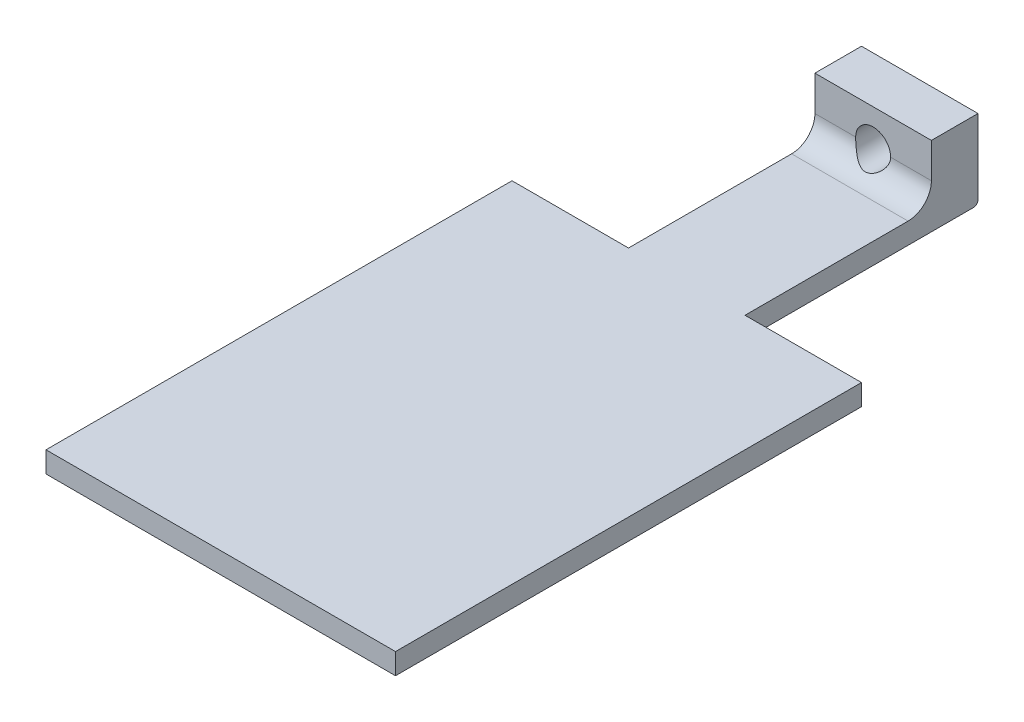
ISO-10303-21;
HEADER;
FILE_DESCRIPTION(('STEP AP214'),'2;1');
FILE_NAME('part.step','',(''),(''),'','','');
FILE_SCHEMA(('AUTOMOTIVE_DESIGN { 1 0 10303 214 1 1 1 1 }'));
ENDSEC;
DATA;
#1=APPLICATION_CONTEXT('core data for automotive mechanical design processes');
#2=APPLICATION_PROTOCOL_DEFINITION('international standard','automotive_design',2000,#1);
#3=PRODUCT_CONTEXT('',#1,'mechanical');
#4=PRODUCT('Part','Part','',(#3));
#5=PRODUCT_RELATED_PRODUCT_CATEGORY('part','',(#4));
#6=PRODUCT_DEFINITION_FORMATION('','',#4);
#7=PRODUCT_DEFINITION_CONTEXT('part definition',#1,'design');
#8=PRODUCT_DEFINITION('design','',#6,#7);
#9=PRODUCT_DEFINITION_SHAPE('','',#8);
#10=(LENGTH_UNIT() NAMED_UNIT(*) SI_UNIT(.MILLI.,.METRE.));
#11=(NAMED_UNIT(*) PLANE_ANGLE_UNIT() SI_UNIT($,.RADIAN.));
#12=(NAMED_UNIT(*) SI_UNIT($,.STERADIAN.) SOLID_ANGLE_UNIT());
#13=UNCERTAINTY_MEASURE_WITH_UNIT(LENGTH_MEASURE(1.E-05),#10,'distance_accuracy_value','');
#14=(GEOMETRIC_REPRESENTATION_CONTEXT(3) GLOBAL_UNCERTAINTY_ASSIGNED_CONTEXT((#13)) GLOBAL_UNIT_ASSIGNED_CONTEXT((#10,
#11,#12)) REPRESENTATION_CONTEXT('',''));
#15=CARTESIAN_POINT('',(0.,0.,0.));
#16=DIRECTION('',(0.,0.,1.));
#17=DIRECTION('',(1.,0.,0.));
#18=AXIS2_PLACEMENT_3D('',#15,#16,#17);
#19=CARTESIAN_POINT('',(0.,1.8,0.));
#20=DIRECTION('',(1.,0.,0.));
#21=DIRECTION('',(0.,0.,-1.));
#22=AXIS2_PLACEMENT_3D('',#19,#20,#21);
#23=PLANE('',#22);
#24=DIRECTION('',(0.,0.,1.));
#25=VECTOR('',#24,1.);
#26=CARTESIAN_POINT('',(0.,0.,0.));
#27=LINE('',#26,#25);
#28=CARTESIAN_POINT('',(0.,0.,0.));
#29=VERTEX_POINT('',#28);
#30=CARTESIAN_POINT('',(0.,0.,40.));
#31=VERTEX_POINT('',#30);
#32=EDGE_CURVE('E153',#29,#31,#27,.T.);
#33=ORIENTED_EDGE('',*,*,#32,.T.);
#34=DIRECTION('',(0.,-1.,0.));
#35=VECTOR('',#34,1.);
#36=CARTESIAN_POINT('',(0.,1.8,40.));
#37=LINE('',#36,#35);
#38=CARTESIAN_POINT('',(0.,1.8,40.));
#39=VERTEX_POINT('',#38);
#40=EDGE_CURVE('E208',#39,#31,#37,.T.);
#41=ORIENTED_EDGE('',*,*,#40,.F.);
#42=DIRECTION('',(0.,0.,1.));
#43=VECTOR('',#42,1.);
#44=CARTESIAN_POINT('',(0.,1.8,0.));
#45=LINE('',#44,#43);
#46=CARTESIAN_POINT('',(0.,1.8,0.));
#47=VERTEX_POINT('',#46);
#48=EDGE_CURVE('E161',#47,#39,#45,.T.);
#49=ORIENTED_EDGE('',*,*,#48,.F.);
#50=DIRECTION('',(0.,-1.,0.));
#51=VECTOR('',#50,1.);
#52=CARTESIAN_POINT('',(0.,1.8,0.));
#53=LINE('',#52,#51);
#54=EDGE_CURVE('E177',#47,#29,#53,.T.);
#55=ORIENTED_EDGE('',*,*,#54,.T.);
#56=EDGE_LOOP('',(#33,#41,#49,#55));
#57=FACE_BOUND('',#56,.T.);
#58=ADVANCED_FACE('F33',(#57),#23,.F.);
#59=CARTESIAN_POINT('',(0.,1.8,40.));
#60=DIRECTION('',(0.,0.,-1.));
#61=DIRECTION('',(-1.,0.,0.));
#62=AXIS2_PLACEMENT_3D('',#59,#60,#61);
#63=PLANE('',#62);
#64=DIRECTION('',(1.,0.,0.));
#65=VECTOR('',#64,1.);
#66=CARTESIAN_POINT('',(0.,0.,40.));
#67=LINE('',#66,#65);
#68=CARTESIAN_POINT('',(30.,0.,40.));
#69=VERTEX_POINT('',#68);
#70=EDGE_CURVE('E156',#31,#69,#67,.T.);
#71=ORIENTED_EDGE('',*,*,#70,.T.);
#72=DIRECTION('',(0.,-1.,0.));
#73=VECTOR('',#72,1.);
#74=CARTESIAN_POINT('',(30.,1.8,40.));
#75=LINE('',#74,#73);
#76=CARTESIAN_POINT('',(30.,1.8,40.));
#77=VERTEX_POINT('',#76);
#78=EDGE_CURVE('E205',#77,#69,#75,.T.);
#79=ORIENTED_EDGE('',*,*,#78,.F.);
#80=DIRECTION('',(1.,0.,0.));
#81=VECTOR('',#80,1.);
#82=CARTESIAN_POINT('',(0.,1.8,40.));
#83=LINE('',#82,#81);
#84=EDGE_CURVE('E164',#39,#77,#83,.T.);
#85=ORIENTED_EDGE('',*,*,#84,.F.);
#86=ORIENTED_EDGE('',*,*,#40,.T.);
#87=EDGE_LOOP('',(#71,#79,#85,#86));
#88=FACE_BOUND('',#87,.T.);
#89=ADVANCED_FACE('F239',(#88),#63,.F.);
#90=CARTESIAN_POINT('',(30.,1.8,0.));
#91=DIRECTION('',(-1.,0.,0.));
#92=DIRECTION('',(0.,0.,1.));
#93=AXIS2_PLACEMENT_3D('',#90,#91,#92);
#94=PLANE('',#93);
#95=DIRECTION('',(0.,0.,-1.));
#96=VECTOR('',#95,1.);
#97=CARTESIAN_POINT('',(30.,0.,0.));
#98=LINE('',#97,#96);
#99=CARTESIAN_POINT('',(30.,0.,0.));
#100=VERTEX_POINT('',#99);
#101=EDGE_CURVE('E180',#69,#100,#98,.T.);
#102=ORIENTED_EDGE('',*,*,#101,.T.);
#103=DIRECTION('',(0.,-1.,0.));
#104=VECTOR('',#103,1.);
#105=CARTESIAN_POINT('',(30.,1.8,0.));
#106=LINE('',#105,#104);
#107=CARTESIAN_POINT('',(30.,1.8,0.));
#108=VERTEX_POINT('',#107);
#109=EDGE_CURVE('E202',#108,#100,#106,.T.);
#110=ORIENTED_EDGE('',*,*,#109,.F.);
#111=DIRECTION('',(0.,0.,-1.));
#112=VECTOR('',#111,1.);
#113=CARTESIAN_POINT('',(30.,1.8,0.));
#114=LINE('',#113,#112);
#115=EDGE_CURVE('E167',#77,#108,#114,.T.);
#116=ORIENTED_EDGE('',*,*,#115,.F.);
#117=ORIENTED_EDGE('',*,*,#78,.T.);
#118=EDGE_LOOP('',(#102,#110,#116,#117));
#119=FACE_BOUND('',#118,.T.);
#120=ADVANCED_FACE('F243',(#119),#94,.F.);
#121=CARTESIAN_POINT('',(20.,1.8,0.));
#122=DIRECTION('',(0.,0.,1.));
#123=DIRECTION('',(1.,0.,0.));
#124=AXIS2_PLACEMENT_3D('',#121,#122,#123);
#125=PLANE('',#124);
#126=DIRECTION('',(-1.,0.,0.));
#127=VECTOR('',#126,1.);
#128=CARTESIAN_POINT('',(20.,0.,0.));
#129=LINE('',#128,#127);
#130=CARTESIAN_POINT('',(20.,0.,0.));
#131=VERTEX_POINT('',#130);
#132=EDGE_CURVE('E182',#100,#131,#129,.T.);
#133=ORIENTED_EDGE('',*,*,#132,.T.);
#134=DIRECTION('',(0.,-1.,0.));
#135=VECTOR('',#134,1.);
#136=CARTESIAN_POINT('',(20.,1.8,0.));
#137=LINE('',#136,#135);
#138=CARTESIAN_POINT('',(20.,1.8,0.));
#139=VERTEX_POINT('',#138);
#140=EDGE_CURVE('E199',#139,#131,#137,.T.);
#141=ORIENTED_EDGE('',*,*,#140,.F.);
#142=DIRECTION('',(-1.,0.,0.));
#143=VECTOR('',#142,1.);
#144=CARTESIAN_POINT('',(20.,1.8,0.));
#145=LINE('',#144,#143);
#146=EDGE_CURVE('E169',#108,#139,#145,.T.);
#147=ORIENTED_EDGE('',*,*,#146,.F.);
#148=ORIENTED_EDGE('',*,*,#109,.T.);
#149=EDGE_LOOP('',(#133,#141,#147,#148));
#150=FACE_BOUND('',#149,.T.);
#151=ADVANCED_FACE('F247',(#150),#125,.F.);
#152=CARTESIAN_POINT('',(20.,1.8,0.));
#153=DIRECTION('',(-1.,0.,0.));
#154=DIRECTION('',(0.,0.,1.));
#155=AXIS2_PLACEMENT_3D('',#152,#153,#154);
#156=PLANE('',#155);
#157=DIRECTION('',(0.,0.,-1.));
#158=VECTOR('',#157,1.);
#159=CARTESIAN_POINT('',(20.,0.,0.));
#160=LINE('',#159,#158);
#161=CARTESIAN_POINT('',(20.,0.,-19.6));
#162=VERTEX_POINT('',#161);
#163=EDGE_CURVE('E184',#131,#162,#160,.T.);
#164=ORIENTED_EDGE('',*,*,#163,.T.);
#165=CARTESIAN_POINT('',(20.,0.4,-19.6));
#166=DIRECTION('',(-1.,0.,0.));
#167=DIRECTION('',(0.,0.,1.));
#168=AXIS2_PLACEMENT_3D('',#165,#166,#167);
#169=CIRCLE('',#168,0.4);
#170=CARTESIAN_POINT('',(20.,0.4,-20.));
#171=VERTEX_POINT('',#170);
#172=EDGE_CURVE('E11',#162,#171,#169,.F.);
#173=ORIENTED_EDGE('',*,*,#172,.T.);
#174=DIRECTION('',(0.,-1.,0.));
#175=VECTOR('',#174,1.);
#176=CARTESIAN_POINT('',(20.,1.8,-20.));
#177=LINE('',#176,#175);
#178=CARTESIAN_POINT('',(20.,6.8,-20.));
#179=VERTEX_POINT('',#178);
#180=EDGE_CURVE('E196',#179,#171,#177,.T.);
#181=ORIENTED_EDGE('',*,*,#180,.F.);
#182=DIRECTION('',(0.,0.,-1.));
#183=VECTOR('',#182,1.);
#184=CARTESIAN_POINT('',(20.,6.8,-20.));
#185=LINE('',#184,#183);
#186=CARTESIAN_POINT('',(20.,6.8,-16.));
#187=VERTEX_POINT('',#186);
#188=EDGE_CURVE('E139',#187,#179,#185,.T.);
#189=ORIENTED_EDGE('',*,*,#188,.F.);
#190=DIRECTION('',(0.,-1.,0.));
#191=VECTOR('',#190,1.);
#192=CARTESIAN_POINT('',(20.,6.8,-16.));
#193=LINE('',#192,#191);
#194=CARTESIAN_POINT('',(20.,3.8,-16.));
#195=VERTEX_POINT('',#194);
#196=EDGE_CURVE('E135',#187,#195,#193,.T.);
#197=ORIENTED_EDGE('',*,*,#196,.T.);
#198=CARTESIAN_POINT('',(20.,3.8,-14.));
#199=DIRECTION('',(-1.,0.,0.));
#200=DIRECTION('',(0.,0.,1.));
#201=AXIS2_PLACEMENT_3D('',#198,#199,#200);
#202=CIRCLE('',#201,2.);
#203=CARTESIAN_POINT('',(20.,1.8,-14.));
#204=VERTEX_POINT('',#203);
#205=EDGE_CURVE('E227',#195,#204,#202,.T.);
#206=ORIENTED_EDGE('',*,*,#205,.T.);
#207=DIRECTION('',(0.,0.,-1.));
#208=VECTOR('',#207,1.);
#209=CARTESIAN_POINT('',(20.,1.8,0.));
#210=LINE('',#209,#208);
#211=EDGE_CURVE('E171',#139,#204,#210,.T.);
#212=ORIENTED_EDGE('',*,*,#211,.F.);
#213=ORIENTED_EDGE('',*,*,#140,.T.);
#214=EDGE_LOOP('',(#164,#173,#181,#189,#197,#206,#212,#213));
#215=FACE_BOUND('',#214,.T.);
#216=ADVANCED_FACE('F251',(#215),#156,.F.);
#217=CARTESIAN_POINT('',(10.,1.8,-20.));
#218=DIRECTION('',(0.,0.,1.));
#219=DIRECTION('',(1.,0.,0.));
#220=AXIS2_PLACEMENT_3D('',#217,#218,#219);
#221=PLANE('',#220);
#222=CARTESIAN_POINT('',(15.,3.8,-20.));
#223=DIRECTION('',(0.,0.,-1.));
#224=DIRECTION('',(-1.,0.,0.));
#225=AXIS2_PLACEMENT_3D('',#222,#223,#224);
#226=CIRCLE('',#225,1.5);
#227=CARTESIAN_POINT('',(13.5,3.8,-20.));
#228=VERTEX_POINT('',#227);
#229=EDGE_CURVE('E214',#228,#228,#226,.T.);
#230=ORIENTED_EDGE('',*,*,#229,.F.);
#231=EDGE_LOOP('',(#230));
#232=FACE_BOUND('',#231,.T.);
#233=ORIENTED_EDGE('',*,*,#180,.T.);
#234=DIRECTION('',(-1.,0.,0.));
#235=VECTOR('',#234,1.);
#236=CARTESIAN_POINT('',(10.,0.4,-20.));
#237=LINE('',#236,#235);
#238=CARTESIAN_POINT('',(10.,0.4,-20.));
#239=VERTEX_POINT('',#238);
#240=EDGE_CURVE('E289',#171,#239,#237,.T.);
#241=ORIENTED_EDGE('',*,*,#240,.T.);
#242=DIRECTION('',(0.,-1.,0.));
#243=VECTOR('',#242,1.);
#244=CARTESIAN_POINT('',(10.,1.8,-20.));
#245=LINE('',#244,#243);
#246=CARTESIAN_POINT('',(10.,6.8,-20.));
#247=VERTEX_POINT('',#246);
#248=EDGE_CURVE('E194',#247,#239,#245,.T.);
#249=ORIENTED_EDGE('',*,*,#248,.F.);
#250=DIRECTION('',(-1.,0.,0.));
#251=VECTOR('',#250,1.);
#252=CARTESIAN_POINT('',(10.,6.8,-20.));
#253=LINE('',#252,#251);
#254=EDGE_CURVE('E146',#179,#247,#253,.T.);
#255=ORIENTED_EDGE('',*,*,#254,.F.);
#256=EDGE_LOOP('',(#233,#241,#249,#255));
#257=FACE_BOUND('',#256,.T.);
#258=ADVANCED_FACE('F255',(#232,#257),#221,.F.);
#259=CARTESIAN_POINT('',(10.,1.8,0.));
#260=DIRECTION('',(1.,0.,0.));
#261=DIRECTION('',(0.,0.,-1.));
#262=AXIS2_PLACEMENT_3D('',#259,#260,#261);
#263=PLANE('',#262);
#264=ORIENTED_EDGE('',*,*,#248,.T.);
#265=CARTESIAN_POINT('',(10.,0.4,-19.6));
#266=DIRECTION('',(1.,0.,0.));
#267=DIRECTION('',(0.,0.,-1.));
#268=AXIS2_PLACEMENT_3D('',#265,#266,#267);
#269=CIRCLE('',#268,0.4);
#270=CARTESIAN_POINT('',(10.,0.,-19.6));
#271=VERTEX_POINT('',#270);
#272=EDGE_CURVE('E55',#239,#271,#269,.F.);
#273=ORIENTED_EDGE('',*,*,#272,.T.);
#274=DIRECTION('',(0.,0.,1.));
#275=VECTOR('',#274,1.);
#276=CARTESIAN_POINT('',(10.,0.,0.));
#277=LINE('',#276,#275);
#278=CARTESIAN_POINT('',(10.,0.,0.));
#279=VERTEX_POINT('',#278);
#280=EDGE_CURVE('E186',#271,#279,#277,.T.);
#281=ORIENTED_EDGE('',*,*,#280,.T.);
#282=DIRECTION('',(0.,-1.,0.));
#283=VECTOR('',#282,1.);
#284=CARTESIAN_POINT('',(10.,1.8,0.));
#285=LINE('',#284,#283);
#286=CARTESIAN_POINT('',(10.,1.8,0.));
#287=VERTEX_POINT('',#286);
#288=EDGE_CURVE('E191',#287,#279,#285,.T.);
#289=ORIENTED_EDGE('',*,*,#288,.F.);
#290=DIRECTION('',(0.,0.,1.));
#291=VECTOR('',#290,1.);
#292=CARTESIAN_POINT('',(10.,1.8,0.));
#293=LINE('',#292,#291);
#294=CARTESIAN_POINT('',(10.,1.8,-14.));
#295=VERTEX_POINT('',#294);
#296=EDGE_CURVE('E174',#295,#287,#293,.T.);
#297=ORIENTED_EDGE('',*,*,#296,.F.);
#298=CARTESIAN_POINT('',(10.,3.8,-14.));
#299=DIRECTION('',(1.,0.,0.));
#300=DIRECTION('',(0.,0.,-1.));
#301=AXIS2_PLACEMENT_3D('',#298,#299,#300);
#302=CIRCLE('',#301,2.);
#303=CARTESIAN_POINT('',(10.,3.8,-16.));
#304=VERTEX_POINT('',#303);
#305=EDGE_CURVE('E152',#295,#304,#302,.T.);
#306=ORIENTED_EDGE('',*,*,#305,.T.);
#307=DIRECTION('',(0.,-1.,0.));
#308=VECTOR('',#307,1.);
#309=CARTESIAN_POINT('',(10.,6.8,-16.));
#310=LINE('',#309,#308);
#311=CARTESIAN_POINT('',(10.,6.8,-16.));
#312=VERTEX_POINT('',#311);
#313=EDGE_CURVE('E132',#312,#304,#310,.T.);
#314=ORIENTED_EDGE('',*,*,#313,.F.);
#315=DIRECTION('',(0.,0.,1.));
#316=VECTOR('',#315,1.);
#317=CARTESIAN_POINT('',(10.,6.8,-20.));
#318=LINE('',#317,#316);
#319=EDGE_CURVE('E140',#247,#312,#318,.T.);
#320=ORIENTED_EDGE('',*,*,#319,.F.);
#321=EDGE_LOOP('',(#264,#273,#281,#289,#297,#306,#314,#320));
#322=FACE_BOUND('',#321,.T.);
#323=ADVANCED_FACE('F149',(#322),#263,.F.);
#324=CARTESIAN_POINT('',(0.,1.8,0.));
#325=DIRECTION('',(0.,0.,1.));
#326=DIRECTION('',(1.,0.,0.));
#327=AXIS2_PLACEMENT_3D('',#324,#325,#326);
#328=PLANE('',#327);
#329=DIRECTION('',(-1.,0.,0.));
#330=VECTOR('',#329,1.);
#331=CARTESIAN_POINT('',(0.,0.,0.));
#332=LINE('',#331,#330);
#333=EDGE_CURVE('E165',#279,#29,#332,.T.);
#334=ORIENTED_EDGE('',*,*,#333,.T.);
#335=ORIENTED_EDGE('',*,*,#54,.F.);
#336=DIRECTION('',(-1.,0.,0.));
#337=VECTOR('',#336,1.);
#338=CARTESIAN_POINT('',(0.,1.8,0.));
#339=LINE('',#338,#337);
#340=EDGE_CURVE('E176',#287,#47,#339,.T.);
#341=ORIENTED_EDGE('',*,*,#340,.F.);
#342=ORIENTED_EDGE('',*,*,#288,.T.);
#343=EDGE_LOOP('',(#334,#335,#341,#342));
#344=FACE_BOUND('',#343,.T.);
#345=ADVANCED_FACE('F262',(#344),#328,.F.);
#346=CARTESIAN_POINT('',(0.,1.8,0.));
#347=DIRECTION('',(0.,1.,0.));
#348=DIRECTION('',(0.,0.,1.));
#349=AXIS2_PLACEMENT_3D('',#346,#347,#348);
#350=PLANE('',#349);
#351=ORIENTED_EDGE('',*,*,#211,.T.);
#352=DIRECTION('',(1.,0.,0.));
#353=VECTOR('',#352,1.);
#354=CARTESIAN_POINT('',(0.,1.8,-14.));
#355=LINE('',#354,#353);
#356=EDGE_CURVE('E218',#204,#295,#355,.F.);
#357=ORIENTED_EDGE('',*,*,#356,.T.);
#358=ORIENTED_EDGE('',*,*,#296,.T.);
#359=ORIENTED_EDGE('',*,*,#340,.T.);
#360=ORIENTED_EDGE('',*,*,#48,.T.);
#361=ORIENTED_EDGE('',*,*,#84,.T.);
#362=ORIENTED_EDGE('',*,*,#115,.T.);
#363=ORIENTED_EDGE('',*,*,#146,.T.);
#364=EDGE_LOOP('',(#351,#357,#358,#359,#360,#361,#362,#363));
#365=FACE_BOUND('',#364,.T.);
#366=ADVANCED_FACE('F265',(#365),#350,.T.);
#367=CARTESIAN_POINT('',(0.,0.,0.));
#368=DIRECTION('',(0.,1.,0.));
#369=DIRECTION('',(0.,0.,1.));
#370=AXIS2_PLACEMENT_3D('',#367,#368,#369);
#371=PLANE('',#370);
#372=ORIENTED_EDGE('',*,*,#280,.F.);
#373=DIRECTION('',(-1.,0.,0.));
#374=VECTOR('',#373,1.);
#375=CARTESIAN_POINT('',(0.,0.,-19.6));
#376=LINE('',#375,#374);
#377=EDGE_CURVE('E41',#271,#162,#376,.F.);
#378=ORIENTED_EDGE('',*,*,#377,.T.);
#379=ORIENTED_EDGE('',*,*,#163,.F.);
#380=ORIENTED_EDGE('',*,*,#132,.F.);
#381=ORIENTED_EDGE('',*,*,#101,.F.);
#382=ORIENTED_EDGE('',*,*,#70,.F.);
#383=ORIENTED_EDGE('',*,*,#32,.F.);
#384=ORIENTED_EDGE('',*,*,#333,.F.);
#385=EDGE_LOOP('',(#372,#378,#379,#380,#381,#382,#383,#384));
#386=FACE_BOUND('',#385,.T.);
#387=ADVANCED_FACE('F267',(#386),#371,.F.);
#388=CARTESIAN_POINT('',(10.,6.8,-16.));
#389=DIRECTION('',(0.,0.,-1.));
#390=DIRECTION('',(-1.,0.,0.));
#391=AXIS2_PLACEMENT_3D('',#388,#389,#390);
#392=PLANE('',#391);
#393=ORIENTED_EDGE('',*,*,#313,.T.);
#394=DIRECTION('',(1.,0.,0.));
#395=VECTOR('',#394,1.);
#396=CARTESIAN_POINT('',(10.,3.8,-16.));
#397=LINE('',#396,#395);
#398=CARTESIAN_POINT('',(13.5,3.8,-16.));
#399=VERTEX_POINT('',#398);
#400=EDGE_CURVE('E216',#304,#399,#397,.T.);
#401=ORIENTED_EDGE('',*,*,#400,.T.);
#402=CARTESIAN_POINT('',(15.,3.8,-16.));
#403=DIRECTION('',(0.,0.,-1.));
#404=DIRECTION('',(-1.,0.,0.));
#405=AXIS2_PLACEMENT_3D('',#402,#403,#404);
#406=CIRCLE('',#405,1.5);
#407=CARTESIAN_POINT('',(16.5,3.8,-16.));
#408=VERTEX_POINT('',#407);
#409=EDGE_CURVE('E147',#399,#408,#406,.T.);
#410=ORIENTED_EDGE('',*,*,#409,.T.);
#411=DIRECTION('',(1.,0.,0.));
#412=VECTOR('',#411,1.);
#413=CARTESIAN_POINT('',(10.,3.8,-16.));
#414=LINE('',#413,#412);
#415=EDGE_CURVE('E211',#408,#195,#414,.T.);
#416=ORIENTED_EDGE('',*,*,#415,.T.);
#417=ORIENTED_EDGE('',*,*,#196,.F.);
#418=DIRECTION('',(1.,0.,0.));
#419=VECTOR('',#418,1.);
#420=CARTESIAN_POINT('',(10.,6.8,-16.));
#421=LINE('',#420,#419);
#422=EDGE_CURVE('E127',#312,#187,#421,.T.);
#423=ORIENTED_EDGE('',*,*,#422,.F.);
#424=EDGE_LOOP('',(#393,#401,#410,#416,#417,#423));
#425=FACE_BOUND('',#424,.T.);
#426=ADVANCED_FACE('F129',(#425),#392,.F.);
#427=CARTESIAN_POINT('',(0.,6.8,0.));
#428=DIRECTION('',(0.,1.,0.));
#429=DIRECTION('',(0.,0.,1.));
#430=AXIS2_PLACEMENT_3D('',#427,#428,#429);
#431=PLANE('',#430);
#432=ORIENTED_EDGE('',*,*,#319,.T.);
#433=ORIENTED_EDGE('',*,*,#422,.T.);
#434=ORIENTED_EDGE('',*,*,#188,.T.);
#435=ORIENTED_EDGE('',*,*,#254,.T.);
#436=EDGE_LOOP('',(#432,#433,#434,#435));
#437=FACE_BOUND('',#436,.T.);
#438=ADVANCED_FACE('F144',(#437),#431,.T.);
#439=CARTESIAN_POINT('',(15.,3.8,-15.));
#440=DIRECTION('',(0.,0.,-1.));
#441=DIRECTION('',(-1.,0.,0.));
#442=AXIS2_PLACEMENT_3D('',#439,#440,#441);
#443=CYLINDRICAL_SURFACE('',#442,1.5);
#444=ORIENTED_EDGE('',*,*,#229,.T.);
#445=EDGE_LOOP('',(#444));
#446=FACE_BOUND('',#445,.T.);
#447=ORIENTED_EDGE('',*,*,#409,.F.);
#448=CARTESIAN_POINT('',(13.5,3.8,-16.));
#449=CARTESIAN_POINT('',(13.4999921972151,3.76316468920704,-16.0000083665075));
#450=CARTESIAN_POINT('',(13.5013565737003,3.72633534689685,-15.9989826308616));
#451=CARTESIAN_POINT('',(13.5067692922404,3.65300841718966,-15.9949265866161));
#452=CARTESIAN_POINT('',(13.5108159208028,3.61651063306406,-15.9918975577752));
#453=CARTESIAN_POINT('',(13.5214966439091,3.54436371091536,-15.983925464393));
#454=CARTESIAN_POINT('',(13.5281130503864,3.50871050231006,-15.9789954859391));
#455=CARTESIAN_POINT('',(13.5438238218425,3.43826092236249,-15.967338721944));
#456=CARTESIAN_POINT('',(13.5529184585652,3.40346464544134,-15.9606117393586));
#457=CARTESIAN_POINT('',(13.5836866667805,3.30086592125138,-15.9379750131355));
#458=CARTESIAN_POINT('',(13.608879567164,3.23462416039438,-15.9195828138828));
#459=CARTESIAN_POINT('',(13.6674867881409,3.10767165233304,-15.8775450789013));
#460=CARTESIAN_POINT('',(13.7009128566821,3.04696898000564,-15.8538920411761));
#461=CARTESIAN_POINT('',(13.7782672448851,2.92652974271119,-15.8004924721808));
#462=CARTESIAN_POINT('',(13.8228779521821,2.86739334050492,-15.7703858998677));
#463=CARTESIAN_POINT('',(13.9195086046198,2.75695953312067,-15.7076621822318));
#464=CARTESIAN_POINT('',(13.9715382277463,2.70567255161865,-15.675041783572));
#465=CARTESIAN_POINT('',(14.0935828532829,2.60162873023678,-15.6027112955189));
#466=CARTESIAN_POINT('',(14.1651036011664,2.55069434099277,-15.5629085915183));
#467=CARTESIAN_POINT('',(14.3174509686116,2.46137996333168,-15.4871144633306));
#468=CARTESIAN_POINT('',(14.3982646688595,2.42298282390738,-15.4511178783573));
#469=CARTESIAN_POINT('',(14.5395025783846,2.37119382820842,-15.3997716468953));
#470=CARTESIAN_POINT('',(14.5973901628166,2.35374341922933,-15.3815776795961));
#471=CARTESIAN_POINT('',(14.7163921725285,2.32579336827463,-15.3517160491288));
#472=CARTESIAN_POINT('',(14.777498892508,2.3152778764203,-15.3400335135041));
#473=CARTESIAN_POINT('',(14.9021825589007,2.30187178216512,-15.3250375999735));
#474=CARTESIAN_POINT('',(14.9657767523099,2.29905045390832,-15.3218002694116));
#475=CARTESIAN_POINT('',(15.0926148565534,2.30151786301318,-15.3245953127142));
#476=CARTESIAN_POINT('',(15.1558586333113,2.30680951489247,-15.3306310178377));
#477=CARTESIAN_POINT('',(15.2731917240628,2.32402266198307,-15.3496762937576));
#478=CARTESIAN_POINT('',(15.327537110833,2.3351752866274,-15.3618717366793));
#479=CARTESIAN_POINT('',(15.433439582197,2.36294351685472,-15.3911421613276));
#480=CARTESIAN_POINT('',(15.4849939704592,2.37956429918907,-15.4082217649187));
#481=CARTESIAN_POINT('',(15.6162551959967,2.4296688953175,-15.4574172465498));
#482=CARTESIAN_POINT('',(15.6933981477999,2.46719737155961,-15.4922554665053));
#483=CARTESIAN_POINT('',(15.8391945298143,2.55381837687385,-15.5653318695528));
#484=CARTESIAN_POINT('',(15.9078264449113,2.60293933684928,-15.6035782654249));
#485=CARTESIAN_POINT('',(16.0377490552059,2.71348012664005,-15.6805141496507));
#486=CARTESIAN_POINT('',(16.0988124717469,2.77517750645692,-15.7191906947745));
#487=CARTESIAN_POINT('',(16.2102571671265,2.90956859773408,-15.7924759419059));
#488=CARTESIAN_POINT('',(16.2606575145554,2.98224227451932,-15.8270918552087));
#489=CARTESIAN_POINT('',(16.3400056203754,3.1221404262032,-15.8828146420148));
#490=CARTESIAN_POINT('',(16.3712279219209,3.18754707628176,-15.9052386766592));
#491=CARTESIAN_POINT('',(16.4242576981687,3.32375635389165,-15.9437533804877));
#492=CARTESIAN_POINT('',(16.4460843993673,3.39454760983862,-15.9598569773525));
#493=CARTESIAN_POINT('',(16.4748937197734,3.52116128805728,-15.9812223409187));
#494=CARTESIAN_POINT('',(16.4842484062315,3.57616225320472,-15.9882059612518));
#495=CARTESIAN_POINT('',(16.4968291214795,3.68741987141975,-15.9976218463363));
#496=CARTESIAN_POINT('',(16.5000351577182,3.74368002098441,-16.0000392635352));
#497=CARTESIAN_POINT('',(16.5,3.8,-16.));
#498=B_SPLINE_CURVE_WITH_KNOTS('',3,(#448,#449,#450,#451,#452,#453,#454,#455,#456,#457,#458,
#459,#460,#461,#462,#463,#464,#465,#466,#467,#468,#469,#470,#471,#472,#473,#474,#475,#476,#477,
#478,#479,#480,#481,#482,#483,#484,#485,#486,#487,#488,#489,#490,#491,#492,#493,#494,#495,#496,
#497),.UNSPECIFIED.,.F.,.F.,(4,2,2,2,2,2,2,2,2,2,2,2,2,2,2,2,2,2,2,2,2,2,2,2,4),(0.,
0.110456638281348,0.220842781900622,0.330482219060254,0.440133683289348,0.658744876229176,
0.877669832235192,1.11669061900119,1.3560261107998,1.64403747288063,1.93165316724475,
2.1204317456707,2.30877735805772,2.49881322122129,2.68891736911565,2.85870748207876,
3.02865880156913,3.30492671216056,3.58187935117474,3.86577772989127,4.14916404440415,
4.37586448103874,4.60209878268211,4.77026747502001,4.93898205278436),.UNSPECIFIED.);
#499=EDGE_CURVE('E220',#399,#408,#498,.T.);
#500=ORIENTED_EDGE('',*,*,#499,.T.);
#501=EDGE_LOOP('',(#447,#500));
#502=FACE_BOUND('',#501,.T.);
#503=ADVANCED_FACE('F229',(#446,#502),#443,.F.);
#504=CARTESIAN_POINT('',(10.,3.8,-14.));
#505=DIRECTION('',(1.,0.,0.));
#506=DIRECTION('',(0.,0.,-1.));
#507=AXIS2_PLACEMENT_3D('',#504,#505,#506);
#508=CYLINDRICAL_SURFACE('',#507,2.);
#509=ORIENTED_EDGE('',*,*,#305,.F.);
#510=ORIENTED_EDGE('',*,*,#356,.F.);
#511=ORIENTED_EDGE('',*,*,#205,.F.);
#512=ORIENTED_EDGE('',*,*,#415,.F.);
#513=ORIENTED_EDGE('',*,*,#499,.F.);
#514=ORIENTED_EDGE('',*,*,#400,.F.);
#515=EDGE_LOOP('',(#509,#510,#511,#512,#513,#514));
#516=FACE_BOUND('',#515,.T.);
#517=ADVANCED_FACE('F232',(#516),#508,.F.);
#518=CARTESIAN_POINT('',(10.,0.4,-19.6));
#519=DIRECTION('',(-1.,0.,0.));
#520=DIRECTION('',(0.,0.,1.));
#521=AXIS2_PLACEMENT_3D('',#518,#519,#520);
#522=CYLINDRICAL_SURFACE('',#521,0.4);
#523=ORIENTED_EDGE('',*,*,#172,.F.);
#524=ORIENTED_EDGE('',*,*,#377,.F.);
#525=ORIENTED_EDGE('',*,*,#272,.F.);
#526=ORIENTED_EDGE('',*,*,#240,.F.);
#527=EDGE_LOOP('',(#523,#524,#525,#526));
#528=FACE_BOUND('',#527,.T.);
#529=ADVANCED_FACE('F35',(#528),#522,.T.);
#530=CLOSED_SHELL('',(#58,#89,#120,#151,#216,#258,#323,#345,#366,#387,#426,#438,#503,#517,#529));
#531=MANIFOLD_SOLID_BREP('B2',#530);
#532=ADVANCED_BREP_SHAPE_REPRESENTATION('',(#18,#531),#14);
#533=SHAPE_DEFINITION_REPRESENTATION(#9,#532);
ENDSEC;
END-ISO-10303-21;
